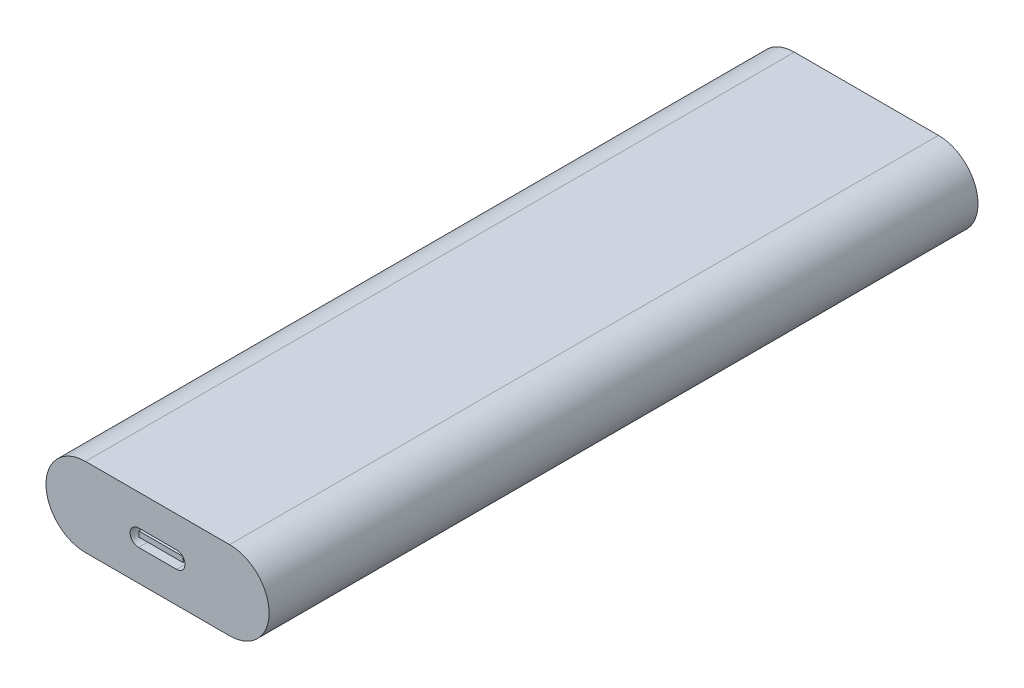
ISO-10303-21;
HEADER;
FILE_DESCRIPTION(('STEP AP214'),'2;1');
FILE_NAME('part.step','',(''),(''),'','','');
FILE_SCHEMA(('AUTOMOTIVE_DESIGN { 1 0 10303 214 1 1 1 1 }'));
ENDSEC;
DATA;
#1=APPLICATION_CONTEXT('core data for automotive mechanical design processes');
#2=APPLICATION_PROTOCOL_DEFINITION('international standard','automotive_design',2000,#1);
#3=PRODUCT_CONTEXT('',#1,'mechanical');
#4=PRODUCT('Part','Part','',(#3));
#5=PRODUCT_RELATED_PRODUCT_CATEGORY('part','',(#4));
#6=PRODUCT_DEFINITION_FORMATION('','',#4);
#7=PRODUCT_DEFINITION_CONTEXT('part definition',#1,'design');
#8=PRODUCT_DEFINITION('design','',#6,#7);
#9=PRODUCT_DEFINITION_SHAPE('','',#8);
#10=(LENGTH_UNIT() NAMED_UNIT(*) SI_UNIT(.MILLI.,.METRE.));
#11=(NAMED_UNIT(*) PLANE_ANGLE_UNIT() SI_UNIT($,.RADIAN.));
#12=(NAMED_UNIT(*) SI_UNIT($,.STERADIAN.) SOLID_ANGLE_UNIT());
#13=UNCERTAINTY_MEASURE_WITH_UNIT(LENGTH_MEASURE(1.E-05),#10,'distance_accuracy_value','');
#14=(GEOMETRIC_REPRESENTATION_CONTEXT(3) GLOBAL_UNCERTAINTY_ASSIGNED_CONTEXT((#13)) GLOBAL_UNIT_ASSIGNED_CONTEXT((#10,
#11,#12)) REPRESENTATION_CONTEXT('',''));
#15=CARTESIAN_POINT('',(0.,0.,0.));
#16=DIRECTION('',(0.,0.,1.));
#17=DIRECTION('',(1.,0.,0.));
#18=AXIS2_PLACEMENT_3D('',#15,#16,#17);
#19=CARTESIAN_POINT('',(-2.89,0.,-6.5));
#20=DIRECTION('',(0.,0.,1.));
#21=DIRECTION('',(1.,0.,0.));
#22=AXIS2_PLACEMENT_3D('',#19,#20,#21);
#23=PLANE('',#22);
#24=CARTESIAN_POINT('',(-2.89,0.,-6.5));
#25=DIRECTION('',(0.,0.,1.));
#26=DIRECTION('',(1.,0.,0.));
#27=AXIS2_PLACEMENT_3D('',#24,#25,#26);
#28=CIRCLE('',#27,1.28);
#29=CARTESIAN_POINT('',(-2.89,1.28,-6.5));
#30=VERTEX_POINT('',#29);
#31=CARTESIAN_POINT('',(-2.89,-1.28,-6.5));
#32=VERTEX_POINT('',#31);
#33=EDGE_CURVE('E170',#30,#32,#28,.T.);
#34=ORIENTED_EDGE('',*,*,#33,.T.);
#35=DIRECTION('',(1.,0.,0.));
#36=VECTOR('',#35,1.);
#37=CARTESIAN_POINT('',(-2.89,-1.28,-6.5));
#38=LINE('',#37,#36);
#39=CARTESIAN_POINT('',(2.89,-1.28,-6.5));
#40=VERTEX_POINT('',#39);
#41=EDGE_CURVE('E173',#32,#40,#38,.T.);
#42=ORIENTED_EDGE('',*,*,#41,.T.);
#43=CARTESIAN_POINT('',(2.89,0.,-6.5));
#44=DIRECTION('',(0.,0.,1.));
#45=DIRECTION('',(1.,0.,0.));
#46=AXIS2_PLACEMENT_3D('',#43,#44,#45);
#47=CIRCLE('',#46,1.28);
#48=CARTESIAN_POINT('',(2.89,1.28,-6.5));
#49=VERTEX_POINT('',#48);
#50=EDGE_CURVE('E177',#40,#49,#47,.T.);
#51=ORIENTED_EDGE('',*,*,#50,.T.);
#52=DIRECTION('',(-1.,0.,0.));
#53=VECTOR('',#52,1.);
#54=CARTESIAN_POINT('',(-2.89,1.28,-6.5));
#55=LINE('',#54,#53);
#56=EDGE_CURVE('E180',#49,#30,#55,.T.);
#57=ORIENTED_EDGE('',*,*,#56,.T.);
#58=EDGE_LOOP('',(#34,#42,#51,#57));
#59=FACE_BOUND('',#58,.T.);
#60=DIRECTION('',(-1.,0.,0.));
#61=VECTOR('',#60,1.);
#62=CARTESIAN_POINT('',(-3.345,0.4,-6.5));
#63=LINE('',#62,#61);
#64=CARTESIAN_POINT('',(3.345,0.4,-6.5));
#65=VERTEX_POINT('',#64);
#66=CARTESIAN_POINT('',(-3.345,0.4,-6.5));
#67=VERTEX_POINT('',#66);
#68=EDGE_CURVE('E166',#65,#67,#63,.T.);
#69=ORIENTED_EDGE('',*,*,#68,.F.);
#70=DIRECTION('',(0.,1.,0.));
#71=VECTOR('',#70,1.);
#72=CARTESIAN_POINT('',(3.345,-0.4,-6.5));
#73=LINE('',#72,#71);
#74=CARTESIAN_POINT('',(3.345,-0.4,-6.5));
#75=VERTEX_POINT('',#74);
#76=EDGE_CURVE('E160',#75,#65,#73,.T.);
#77=ORIENTED_EDGE('',*,*,#76,.F.);
#78=DIRECTION('',(1.,0.,0.));
#79=VECTOR('',#78,1.);
#80=CARTESIAN_POINT('',(-3.345,-0.4,-6.5));
#81=LINE('',#80,#79);
#82=CARTESIAN_POINT('',(-3.345,-0.4,-6.5));
#83=VERTEX_POINT('',#82);
#84=EDGE_CURVE('E141',#83,#75,#81,.T.);
#85=ORIENTED_EDGE('',*,*,#84,.F.);
#86=DIRECTION('',(0.,-1.,0.));
#87=VECTOR('',#86,1.);
#88=CARTESIAN_POINT('',(-3.345,-0.4,-6.5));
#89=LINE('',#88,#87);
#90=EDGE_CURVE('E62',#67,#83,#89,.T.);
#91=ORIENTED_EDGE('',*,*,#90,.F.);
#92=EDGE_LOOP('',(#69,#77,#85,#91));
#93=FACE_BOUND('',#92,.T.);
#94=ADVANCED_FACE('F45',(#59,#93),#23,.T.);
#95=CARTESIAN_POINT('',(-10.95,0.,-107.7));
#96=DIRECTION('',(0.,0.,1.));
#97=DIRECTION('',(1.,0.,0.));
#98=AXIS2_PLACEMENT_3D('',#95,#96,#97);
#99=CYLINDRICAL_SURFACE('',#98,6.00000000000001);
#100=CARTESIAN_POINT('',(-10.95,0.,0.));
#101=DIRECTION('',(0.,0.,1.));
#102=DIRECTION('',(1.,0.,0.));
#103=AXIS2_PLACEMENT_3D('',#100,#101,#102);
#104=CIRCLE('',#103,6.00000000000001);
#105=CARTESIAN_POINT('',(-10.95,6.00000000000001,0.));
#106=VERTEX_POINT('',#105);
#107=CARTESIAN_POINT('',(-10.95,-6.00000000000001,0.));
#108=VERTEX_POINT('',#107);
#109=EDGE_CURVE('E193',#106,#108,#104,.T.);
#110=ORIENTED_EDGE('',*,*,#109,.F.);
#111=DIRECTION('',(0.,0.,1.));
#112=VECTOR('',#111,1.);
#113=CARTESIAN_POINT('',(-10.95,6.00000000000001,-107.7));
#114=LINE('',#113,#112);
#115=CARTESIAN_POINT('',(-10.95,6.00000000000001,-107.7));
#116=VERTEX_POINT('',#115);
#117=EDGE_CURVE('E12',#116,#106,#114,.T.);
#118=ORIENTED_EDGE('',*,*,#117,.F.);
#119=CARTESIAN_POINT('',(-10.95,0.,-107.7));
#120=DIRECTION('',(0.,0.,1.));
#121=DIRECTION('',(1.,0.,0.));
#122=AXIS2_PLACEMENT_3D('',#119,#120,#121);
#123=CIRCLE('',#122,6.00000000000001);
#124=CARTESIAN_POINT('',(-10.95,-6.00000000000001,-107.7));
#125=VERTEX_POINT('',#124);
#126=EDGE_CURVE('E199',#116,#125,#123,.T.);
#127=ORIENTED_EDGE('',*,*,#126,.T.);
#128=DIRECTION('',(0.,0.,1.));
#129=VECTOR('',#128,1.);
#130=CARTESIAN_POINT('',(-10.95,-6.00000000000001,-107.7));
#131=LINE('',#130,#129);
#132=EDGE_CURVE('E49',#125,#108,#131,.T.);
#133=ORIENTED_EDGE('',*,*,#132,.T.);
#134=EDGE_LOOP('',(#110,#118,#127,#133));
#135=FACE_BOUND('',#134,.T.);
#136=ADVANCED_FACE('F47',(#135),#99,.T.);
#137=CARTESIAN_POINT('',(-10.95,6.00000000000001,-107.7));
#138=DIRECTION('',(0.,1.,0.));
#139=DIRECTION('',(0.,0.,1.));
#140=AXIS2_PLACEMENT_3D('',#137,#138,#139);
#141=PLANE('',#140);
#142=DIRECTION('',(-1.,0.,0.));
#143=VECTOR('',#142,1.);
#144=CARTESIAN_POINT('',(-10.95,6.00000000000001,0.));
#145=LINE('',#144,#143);
#146=CARTESIAN_POINT('',(10.95,6.00000000000001,0.));
#147=VERTEX_POINT('',#146);
#148=EDGE_CURVE('E203',#147,#106,#145,.T.);
#149=ORIENTED_EDGE('',*,*,#148,.F.);
#150=DIRECTION('',(0.,0.,1.));
#151=VECTOR('',#150,1.);
#152=CARTESIAN_POINT('',(10.95,6.00000000000001,-107.7));
#153=LINE('',#152,#151);
#154=CARTESIAN_POINT('',(10.95,6.00000000000001,-107.7));
#155=VERTEX_POINT('',#154);
#156=EDGE_CURVE('E54',#155,#147,#153,.T.);
#157=ORIENTED_EDGE('',*,*,#156,.F.);
#158=DIRECTION('',(-1.,0.,0.));
#159=VECTOR('',#158,1.);
#160=CARTESIAN_POINT('',(-10.95,6.00000000000001,-107.7));
#161=LINE('',#160,#159);
#162=EDGE_CURVE('E209',#155,#116,#161,.T.);
#163=ORIENTED_EDGE('',*,*,#162,.T.);
#164=ORIENTED_EDGE('',*,*,#117,.T.);
#165=EDGE_LOOP('',(#149,#157,#163,#164));
#166=FACE_BOUND('',#165,.T.);
#167=ADVANCED_FACE('F235',(#166),#141,.T.);
#168=CARTESIAN_POINT('',(10.95,0.,-107.7));
#169=DIRECTION('',(0.,0.,1.));
#170=DIRECTION('',(1.,0.,0.));
#171=AXIS2_PLACEMENT_3D('',#168,#169,#170);
#172=CYLINDRICAL_SURFACE('',#171,6.00000000000001);
#173=CARTESIAN_POINT('',(10.95,0.,0.));
#174=DIRECTION('',(0.,0.,1.));
#175=DIRECTION('',(1.,0.,0.));
#176=AXIS2_PLACEMENT_3D('',#173,#174,#175);
#177=CIRCLE('',#176,6.00000000000001);
#178=CARTESIAN_POINT('',(10.95,-6.00000000000001,0.));
#179=VERTEX_POINT('',#178);
#180=EDGE_CURVE('E217',#179,#147,#177,.T.);
#181=ORIENTED_EDGE('',*,*,#180,.F.);
#182=DIRECTION('',(0.,0.,1.));
#183=VECTOR('',#182,1.);
#184=CARTESIAN_POINT('',(10.95,-6.00000000000001,-107.7));
#185=LINE('',#184,#183);
#186=CARTESIAN_POINT('',(10.95,-6.00000000000001,-107.7));
#187=VERTEX_POINT('',#186);
#188=EDGE_CURVE('E222',#187,#179,#185,.T.);
#189=ORIENTED_EDGE('',*,*,#188,.F.);
#190=CARTESIAN_POINT('',(10.95,0.,-107.7));
#191=DIRECTION('',(0.,0.,1.));
#192=DIRECTION('',(1.,0.,0.));
#193=AXIS2_PLACEMENT_3D('',#190,#191,#192);
#194=CIRCLE('',#193,6.00000000000001);
#195=EDGE_CURVE('E206',#187,#155,#194,.T.);
#196=ORIENTED_EDGE('',*,*,#195,.T.);
#197=ORIENTED_EDGE('',*,*,#156,.T.);
#198=EDGE_LOOP('',(#181,#189,#196,#197));
#199=FACE_BOUND('',#198,.T.);
#200=ADVANCED_FACE('F241',(#199),#172,.T.);
#201=CARTESIAN_POINT('',(-10.95,-6.00000000000001,-107.7));
#202=DIRECTION('',(0.,-1.,0.));
#203=DIRECTION('',(0.,0.,-1.));
#204=AXIS2_PLACEMENT_3D('',#201,#202,#203);
#205=PLANE('',#204);
#206=DIRECTION('',(1.,0.,0.));
#207=VECTOR('',#206,1.);
#208=CARTESIAN_POINT('',(-10.95,-6.00000000000001,0.));
#209=LINE('',#208,#207);
#210=EDGE_CURVE('E214',#108,#179,#209,.T.);
#211=ORIENTED_EDGE('',*,*,#210,.F.);
#212=ORIENTED_EDGE('',*,*,#132,.F.);
#213=DIRECTION('',(1.,0.,0.));
#214=VECTOR('',#213,1.);
#215=CARTESIAN_POINT('',(-10.95,-6.00000000000001,-107.7));
#216=LINE('',#215,#214);
#217=EDGE_CURVE('E202',#125,#187,#216,.T.);
#218=ORIENTED_EDGE('',*,*,#217,.T.);
#219=ORIENTED_EDGE('',*,*,#188,.T.);
#220=EDGE_LOOP('',(#211,#212,#218,#219));
#221=FACE_BOUND('',#220,.T.);
#222=ADVANCED_FACE('F230',(#221),#205,.T.);
#223=CARTESIAN_POINT('',(-10.95,0.,-107.7));
#224=DIRECTION('',(0.,0.,1.));
#225=DIRECTION('',(1.,0.,0.));
#226=AXIS2_PLACEMENT_3D('',#223,#224,#225);
#227=PLANE('',#226);
#228=ORIENTED_EDGE('',*,*,#126,.F.);
#229=ORIENTED_EDGE('',*,*,#162,.F.);
#230=ORIENTED_EDGE('',*,*,#195,.F.);
#231=ORIENTED_EDGE('',*,*,#217,.F.);
#232=EDGE_LOOP('',(#228,#229,#230,#231));
#233=FACE_BOUND('',#232,.T.);
#234=ADVANCED_FACE('F238',(#233),#227,.F.);
#235=CARTESIAN_POINT('',(-10.95,0.,0.));
#236=DIRECTION('',(0.,0.,1.));
#237=DIRECTION('',(1.,0.,0.));
#238=AXIS2_PLACEMENT_3D('',#235,#236,#237);
#239=PLANE('',#238);
#240=CARTESIAN_POINT('',(-2.89,0.,0.));
#241=DIRECTION('',(0.,0.,1.));
#242=DIRECTION('',(1.,0.,0.));
#243=AXIS2_PLACEMENT_3D('',#240,#241,#242);
#244=CIRCLE('',#243,1.28);
#245=CARTESIAN_POINT('',(-2.89,1.28,0.));
#246=VERTEX_POINT('',#245);
#247=CARTESIAN_POINT('',(-2.89,-1.28,0.));
#248=VERTEX_POINT('',#247);
#249=EDGE_CURVE('E70',#246,#248,#244,.T.);
#250=ORIENTED_EDGE('',*,*,#249,.F.);
#251=DIRECTION('',(-1.,0.,0.));
#252=VECTOR('',#251,1.);
#253=CARTESIAN_POINT('',(-2.89,1.28,0.));
#254=LINE('',#253,#252);
#255=CARTESIAN_POINT('',(2.89,1.28,0.));
#256=VERTEX_POINT('',#255);
#257=EDGE_CURVE('E174',#256,#246,#254,.T.);
#258=ORIENTED_EDGE('',*,*,#257,.F.);
#259=CARTESIAN_POINT('',(2.89,0.,0.));
#260=DIRECTION('',(0.,0.,1.));
#261=DIRECTION('',(1.,0.,0.));
#262=AXIS2_PLACEMENT_3D('',#259,#260,#261);
#263=CIRCLE('',#262,1.28);
#264=CARTESIAN_POINT('',(2.89,-1.28,0.));
#265=VERTEX_POINT('',#264);
#266=EDGE_CURVE('E186',#265,#256,#263,.T.);
#267=ORIENTED_EDGE('',*,*,#266,.F.);
#268=DIRECTION('',(1.,0.,0.));
#269=VECTOR('',#268,1.);
#270=CARTESIAN_POINT('',(-2.89,-1.28,0.));
#271=LINE('',#270,#269);
#272=EDGE_CURVE('E156',#248,#265,#271,.T.);
#273=ORIENTED_EDGE('',*,*,#272,.F.);
#274=EDGE_LOOP('',(#250,#258,#267,#273));
#275=FACE_BOUND('',#274,.T.);
#276=ORIENTED_EDGE('',*,*,#109,.T.);
#277=ORIENTED_EDGE('',*,*,#210,.T.);
#278=ORIENTED_EDGE('',*,*,#180,.T.);
#279=ORIENTED_EDGE('',*,*,#148,.T.);
#280=EDGE_LOOP('',(#276,#277,#278,#279));
#281=FACE_BOUND('',#280,.T.);
#282=ADVANCED_FACE('F232',(#275,#281),#239,.T.);
#283=CARTESIAN_POINT('',(-2.89,0.,-6.5));
#284=DIRECTION('',(0.,0.,1.));
#285=DIRECTION('',(1.,0.,0.));
#286=AXIS2_PLACEMENT_3D('',#283,#284,#285);
#287=CYLINDRICAL_SURFACE('',#286,1.28);
#288=ORIENTED_EDGE('',*,*,#249,.T.);
#289=DIRECTION('',(0.,0.,1.));
#290=VECTOR('',#289,1.);
#291=CARTESIAN_POINT('',(-2.89,-1.28,-6.5));
#292=LINE('',#291,#290);
#293=EDGE_CURVE('E182',#32,#248,#292,.T.);
#294=ORIENTED_EDGE('',*,*,#293,.F.);
#295=ORIENTED_EDGE('',*,*,#33,.F.);
#296=DIRECTION('',(0.,0.,1.));
#297=VECTOR('',#296,1.);
#298=CARTESIAN_POINT('',(-2.89,1.28,-6.5));
#299=LINE('',#298,#297);
#300=EDGE_CURVE('E191',#30,#246,#299,.T.);
#301=ORIENTED_EDGE('',*,*,#300,.T.);
#302=EDGE_LOOP('',(#288,#294,#295,#301));
#303=FACE_BOUND('',#302,.T.);
#304=ADVANCED_FACE('F264',(#303),#287,.F.);
#305=CARTESIAN_POINT('',(-2.89,1.28,-6.5));
#306=DIRECTION('',(0.,1.,0.));
#307=DIRECTION('',(0.,0.,1.));
#308=AXIS2_PLACEMENT_3D('',#305,#306,#307);
#309=PLANE('',#308);
#310=ORIENTED_EDGE('',*,*,#257,.T.);
#311=ORIENTED_EDGE('',*,*,#300,.F.);
#312=ORIENTED_EDGE('',*,*,#56,.F.);
#313=DIRECTION('',(0.,0.,1.));
#314=VECTOR('',#313,1.);
#315=CARTESIAN_POINT('',(2.89,1.28,-6.5));
#316=LINE('',#315,#314);
#317=EDGE_CURVE('E194',#49,#256,#316,.T.);
#318=ORIENTED_EDGE('',*,*,#317,.T.);
#319=EDGE_LOOP('',(#310,#311,#312,#318));
#320=FACE_BOUND('',#319,.T.);
#321=ADVANCED_FACE('F260',(#320),#309,.F.);
#322=CARTESIAN_POINT('',(2.89,0.,-6.5));
#323=DIRECTION('',(0.,0.,1.));
#324=DIRECTION('',(1.,0.,0.));
#325=AXIS2_PLACEMENT_3D('',#322,#323,#324);
#326=CYLINDRICAL_SURFACE('',#325,1.28);
#327=ORIENTED_EDGE('',*,*,#266,.T.);
#328=ORIENTED_EDGE('',*,*,#317,.F.);
#329=ORIENTED_EDGE('',*,*,#50,.F.);
#330=DIRECTION('',(0.,0.,1.));
#331=VECTOR('',#330,1.);
#332=CARTESIAN_POINT('',(2.89,-1.28,-6.5));
#333=LINE('',#332,#331);
#334=EDGE_CURVE('E196',#40,#265,#333,.T.);
#335=ORIENTED_EDGE('',*,*,#334,.T.);
#336=EDGE_LOOP('',(#327,#328,#329,#335));
#337=FACE_BOUND('',#336,.T.);
#338=ADVANCED_FACE('F263',(#337),#326,.F.);
#339=CARTESIAN_POINT('',(-2.89,-1.28,-6.5));
#340=DIRECTION('',(0.,-1.,0.));
#341=DIRECTION('',(0.,0.,-1.));
#342=AXIS2_PLACEMENT_3D('',#339,#340,#341);
#343=PLANE('',#342);
#344=ORIENTED_EDGE('',*,*,#272,.T.);
#345=ORIENTED_EDGE('',*,*,#334,.F.);
#346=ORIENTED_EDGE('',*,*,#41,.F.);
#347=ORIENTED_EDGE('',*,*,#293,.T.);
#348=EDGE_LOOP('',(#344,#345,#346,#347));
#349=FACE_BOUND('',#348,.T.);
#350=ADVANCED_FACE('F268',(#349),#343,.F.);
#351=CARTESIAN_POINT('',(3.345,-0.4,6.73766279951735));
#352=DIRECTION('',(-1.,0.,0.));
#353=DIRECTION('',(0.,0.,1.));
#354=AXIS2_PLACEMENT_3D('',#351,#352,#353);
#355=PLANE('',#354);
#356=DIRECTION('',(0.,1.,0.));
#357=VECTOR('',#356,1.);
#358=CARTESIAN_POINT('',(3.345,-0.4,-0.5));
#359=LINE('',#358,#357);
#360=CARTESIAN_POINT('',(3.345,-0.4,-0.5));
#361=VERTEX_POINT('',#360);
#362=CARTESIAN_POINT('',(3.345,0.4,-0.5));
#363=VERTEX_POINT('',#362);
#364=EDGE_CURVE('E150',#361,#363,#359,.T.);
#365=ORIENTED_EDGE('',*,*,#364,.F.);
#366=DIRECTION('',(0.,0.,-1.));
#367=VECTOR('',#366,1.);
#368=CARTESIAN_POINT('',(3.345,-0.4,6.73766279951735));
#369=LINE('',#368,#367);
#370=EDGE_CURVE('E146',#361,#75,#369,.T.);
#371=ORIENTED_EDGE('',*,*,#370,.T.);
#372=ORIENTED_EDGE('',*,*,#76,.T.);
#373=DIRECTION('',(0.,0.,-1.));
#374=VECTOR('',#373,1.);
#375=CARTESIAN_POINT('',(3.345,0.4,6.73766279951735));
#376=LINE('',#375,#374);
#377=EDGE_CURVE('E164',#363,#65,#376,.T.);
#378=ORIENTED_EDGE('',*,*,#377,.F.);
#379=EDGE_LOOP('',(#365,#371,#372,#378));
#380=FACE_BOUND('',#379,.T.);
#381=ADVANCED_FACE('F272',(#380),#355,.F.);
#382=CARTESIAN_POINT('',(-3.345,0.4,6.73766279951735));
#383=DIRECTION('',(0.,-1.,0.));
#384=DIRECTION('',(0.,0.,-1.));
#385=AXIS2_PLACEMENT_3D('',#382,#383,#384);
#386=PLANE('',#385);
#387=DIRECTION('',(-1.,0.,0.));
#388=VECTOR('',#387,1.);
#389=CARTESIAN_POINT('',(-3.345,0.4,-0.5));
#390=LINE('',#389,#388);
#391=CARTESIAN_POINT('',(-3.345,0.4,-0.5));
#392=VERTEX_POINT('',#391);
#393=EDGE_CURVE('E154',#363,#392,#390,.T.);
#394=ORIENTED_EDGE('',*,*,#393,.F.);
#395=ORIENTED_EDGE('',*,*,#377,.T.);
#396=ORIENTED_EDGE('',*,*,#68,.T.);
#397=DIRECTION('',(0.,0.,-1.));
#398=VECTOR('',#397,1.);
#399=CARTESIAN_POINT('',(-3.345,0.4,6.73766279951735));
#400=LINE('',#399,#398);
#401=EDGE_CURVE('E167',#392,#67,#400,.T.);
#402=ORIENTED_EDGE('',*,*,#401,.F.);
#403=EDGE_LOOP('',(#394,#395,#396,#402));
#404=FACE_BOUND('',#403,.T.);
#405=ADVANCED_FACE('F338',(#404),#386,.F.);
#406=CARTESIAN_POINT('',(-3.345,-0.4,6.73766279951735));
#407=DIRECTION('',(1.,0.,0.));
#408=DIRECTION('',(0.,0.,-1.));
#409=AXIS2_PLACEMENT_3D('',#406,#407,#408);
#410=PLANE('',#409);
#411=DIRECTION('',(0.,-1.,0.));
#412=VECTOR('',#411,1.);
#413=CARTESIAN_POINT('',(-3.345,-0.4,-0.5));
#414=LINE('',#413,#412);
#415=CARTESIAN_POINT('',(-3.345,-0.4,-0.5));
#416=VERTEX_POINT('',#415);
#417=EDGE_CURVE('E136',#392,#416,#414,.T.);
#418=ORIENTED_EDGE('',*,*,#417,.F.);
#419=ORIENTED_EDGE('',*,*,#401,.T.);
#420=ORIENTED_EDGE('',*,*,#90,.T.);
#421=DIRECTION('',(0.,0.,-1.));
#422=VECTOR('',#421,1.);
#423=CARTESIAN_POINT('',(-3.345,-0.4,6.73766279951735));
#424=LINE('',#423,#422);
#425=EDGE_CURVE('E132',#416,#83,#424,.T.);
#426=ORIENTED_EDGE('',*,*,#425,.F.);
#427=EDGE_LOOP('',(#418,#419,#420,#426));
#428=FACE_BOUND('',#427,.T.);
#429=ADVANCED_FACE('F134',(#428),#410,.F.);
#430=CARTESIAN_POINT('',(-3.345,-0.4,6.73766279951735));
#431=DIRECTION('',(0.,1.,0.));
#432=DIRECTION('',(0.,0.,1.));
#433=AXIS2_PLACEMENT_3D('',#430,#431,#432);
#434=PLANE('',#433);
#435=DIRECTION('',(1.,0.,0.));
#436=VECTOR('',#435,1.);
#437=CARTESIAN_POINT('',(-3.345,-0.4,-0.5));
#438=LINE('',#437,#436);
#439=EDGE_CURVE('E144',#416,#361,#438,.T.);
#440=ORIENTED_EDGE('',*,*,#439,.F.);
#441=ORIENTED_EDGE('',*,*,#425,.T.);
#442=ORIENTED_EDGE('',*,*,#84,.T.);
#443=ORIENTED_EDGE('',*,*,#370,.F.);
#444=EDGE_LOOP('',(#440,#441,#442,#443));
#445=FACE_BOUND('',#444,.T.);
#446=ADVANCED_FACE('F145',(#445),#434,.F.);
#447=CARTESIAN_POINT('',(-10.95,0.,-0.5));
#448=DIRECTION('',(0.,0.,1.));
#449=DIRECTION('',(1.,0.,0.));
#450=AXIS2_PLACEMENT_3D('',#447,#448,#449);
#451=PLANE('',#450);
#452=ORIENTED_EDGE('',*,*,#439,.T.);
#453=ORIENTED_EDGE('',*,*,#364,.T.);
#454=ORIENTED_EDGE('',*,*,#393,.T.);
#455=ORIENTED_EDGE('',*,*,#417,.T.);
#456=EDGE_LOOP('',(#452,#453,#454,#455));
#457=FACE_BOUND('',#456,.T.);
#458=ADVANCED_FACE('F153',(#457),#451,.T.);
#459=CLOSED_SHELL('',(#94,#136,#167,#200,#222,#234,#282,#304,#321,#338,#350,#381,#405,#429,#446,#458));
#460=MANIFOLD_SOLID_BREP('B2',#459);
#461=ADVANCED_BREP_SHAPE_REPRESENTATION('',(#18,#460),#14);
#462=SHAPE_DEFINITION_REPRESENTATION(#9,#461);
ENDSEC;
END-ISO-10303-21;
